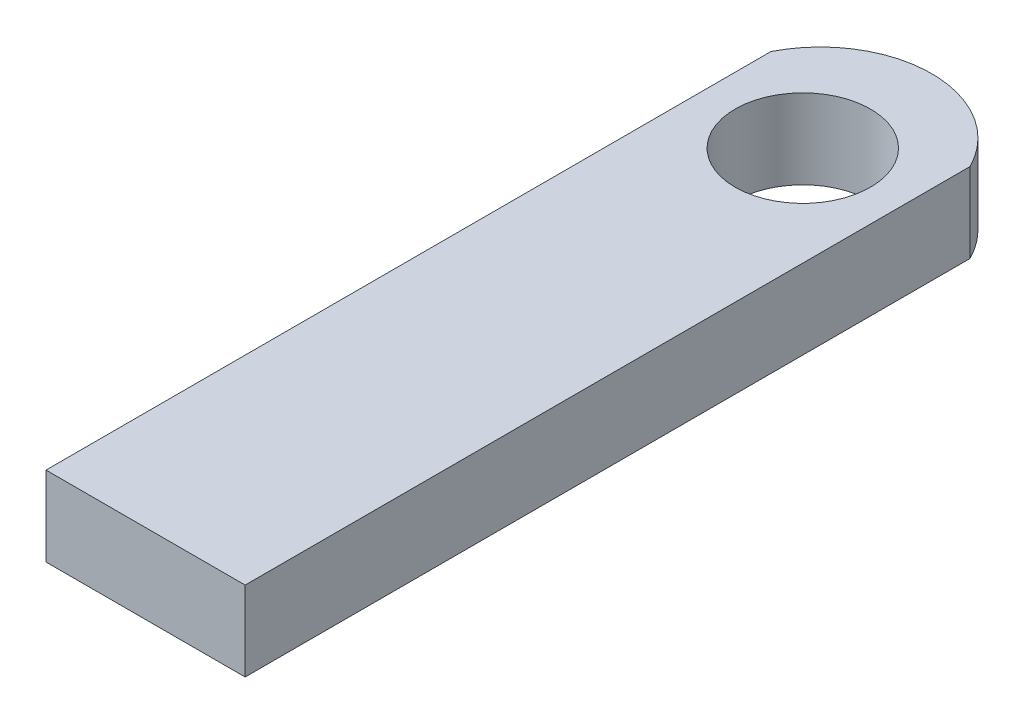
ISO-10303-21;
HEADER;
FILE_DESCRIPTION(('STEP AP214'),'2;1');
FILE_NAME('part.step','',(''),(''),'','','');
FILE_SCHEMA(('AUTOMOTIVE_DESIGN { 1 0 10303 214 1 1 1 1 }'));
ENDSEC;
DATA;
#1=APPLICATION_CONTEXT('core data for automotive mechanical design processes');
#2=APPLICATION_PROTOCOL_DEFINITION('international standard','automotive_design',2000,#1);
#3=PRODUCT_CONTEXT('',#1,'mechanical');
#4=PRODUCT('Part','Part','',(#3));
#5=PRODUCT_RELATED_PRODUCT_CATEGORY('part','',(#4));
#6=PRODUCT_DEFINITION_FORMATION('','',#4);
#7=PRODUCT_DEFINITION_CONTEXT('part definition',#1,'design');
#8=PRODUCT_DEFINITION('design','',#6,#7);
#9=PRODUCT_DEFINITION_SHAPE('','',#8);
#10=(LENGTH_UNIT() NAMED_UNIT(*) SI_UNIT(.MILLI.,.METRE.));
#11=(NAMED_UNIT(*) PLANE_ANGLE_UNIT() SI_UNIT($,.RADIAN.));
#12=(NAMED_UNIT(*) SI_UNIT($,.STERADIAN.) SOLID_ANGLE_UNIT());
#13=UNCERTAINTY_MEASURE_WITH_UNIT(LENGTH_MEASURE(1.E-05),#10,'distance_accuracy_value','');
#14=(GEOMETRIC_REPRESENTATION_CONTEXT(3) GLOBAL_UNCERTAINTY_ASSIGNED_CONTEXT((#13)) GLOBAL_UNIT_ASSIGNED_CONTEXT((#10,
#11,#12)) REPRESENTATION_CONTEXT('',''));
#15=CARTESIAN_POINT('',(0.,0.,0.));
#16=DIRECTION('',(0.,0.,1.));
#17=DIRECTION('',(1.,0.,0.));
#18=AXIS2_PLACEMENT_3D('',#15,#16,#17);
#19=CARTESIAN_POINT('',(-2.5,2.,-16.9390479787082));
#20=DIRECTION('',(0.,-1.,0.));
#21=DIRECTION('',(0.,0.,-1.));
#22=AXIS2_PLACEMENT_3D('',#19,#20,#21);
#23=PLANE('',#22);
#24=DIRECTION('',(0.,0.,-1.));
#25=VECTOR('',#24,1.);
#26=CARTESIAN_POINT('',(0.,2.,-18.2));
#27=LINE('',#26,#25);
#28=CARTESIAN_POINT('',(0.,2.,0.));
#29=VERTEX_POINT('',#28);
#30=CARTESIAN_POINT('',(0.,2.,-18.2));
#31=VERTEX_POINT('',#30);
#32=EDGE_CURVE('E87',#29,#31,#27,.T.);
#33=ORIENTED_EDGE('',*,*,#32,.T.);
#34=CARTESIAN_POINT('',(-2.5,2.,-16.9390479787082));
#35=DIRECTION('',(0.,1.,0.));
#36=DIRECTION('',(0.,0.,-1.));
#37=AXIS2_PLACEMENT_3D('',#34,#35,#36);
#38=CIRCLE('',#37,2.8);
#39=CARTESIAN_POINT('',(-5.,2.,-18.2));
#40=VERTEX_POINT('',#39);
#41=EDGE_CURVE('E82',#31,#40,#38,.T.);
#42=ORIENTED_EDGE('',*,*,#41,.T.);
#43=DIRECTION('',(0.,0.,1.));
#44=VECTOR('',#43,1.);
#45=CARTESIAN_POINT('',(-5.,2.,0.));
#46=LINE('',#45,#44);
#47=CARTESIAN_POINT('',(-5.,2.,0.));
#48=VERTEX_POINT('',#47);
#49=EDGE_CURVE('E85',#40,#48,#46,.T.);
#50=ORIENTED_EDGE('',*,*,#49,.T.);
#51=DIRECTION('',(1.,0.,0.));
#52=VECTOR('',#51,1.);
#53=CARTESIAN_POINT('',(0.,2.,0.));
#54=LINE('',#53,#52);
#55=EDGE_CURVE('E52',#48,#29,#54,.T.);
#56=ORIENTED_EDGE('',*,*,#55,.T.);
#57=EDGE_LOOP('',(#33,#42,#50,#56));
#58=FACE_BOUND('',#57,.T.);
#59=CARTESIAN_POINT('',(-2.5,2.,-16.5));
#60=DIRECTION('',(0.,1.,0.));
#61=DIRECTION('',(0.,0.,1.));
#62=AXIS2_PLACEMENT_3D('',#59,#60,#61);
#63=CIRCLE('',#62,1.7);
#64=CARTESIAN_POINT('',(-2.5,2.,-14.8));
#65=VERTEX_POINT('',#64);
#66=EDGE_CURVE('E102',#65,#65,#63,.T.);
#67=ORIENTED_EDGE('',*,*,#66,.F.);
#68=EDGE_LOOP('',(#67));
#69=FACE_BOUND('',#68,.T.);
#70=ADVANCED_FACE('F35',(#58,#69),#23,.F.);
#71=CARTESIAN_POINT('',(-2.5,0.,-16.9390479787082));
#72=DIRECTION('',(0.,-1.,0.));
#73=DIRECTION('',(0.,0.,-1.));
#74=AXIS2_PLACEMENT_3D('',#71,#72,#73);
#75=PLANE('',#74);
#76=DIRECTION('',(0.,0.,-1.));
#77=VECTOR('',#76,1.);
#78=CARTESIAN_POINT('',(0.,0.,-18.2));
#79=LINE('',#78,#77);
#80=CARTESIAN_POINT('',(0.,0.,0.));
#81=VERTEX_POINT('',#80);
#82=CARTESIAN_POINT('',(0.,0.,-18.2));
#83=VERTEX_POINT('',#82);
#84=EDGE_CURVE('E99',#81,#83,#79,.T.);
#85=ORIENTED_EDGE('',*,*,#84,.F.);
#86=DIRECTION('',(1.,0.,0.));
#87=VECTOR('',#86,1.);
#88=CARTESIAN_POINT('',(0.,0.,0.));
#89=LINE('',#88,#87);
#90=CARTESIAN_POINT('',(-5.,0.,0.));
#91=VERTEX_POINT('',#90);
#92=EDGE_CURVE('E75',#91,#81,#89,.T.);
#93=ORIENTED_EDGE('',*,*,#92,.F.);
#94=DIRECTION('',(0.,0.,1.));
#95=VECTOR('',#94,1.);
#96=CARTESIAN_POINT('',(-5.,0.,0.));
#97=LINE('',#96,#95);
#98=CARTESIAN_POINT('',(-5.,0.,-18.2));
#99=VERTEX_POINT('',#98);
#100=EDGE_CURVE('E69',#99,#91,#97,.T.);
#101=ORIENTED_EDGE('',*,*,#100,.F.);
#102=CARTESIAN_POINT('',(-2.5,0.,-16.9390479787082));
#103=DIRECTION('',(0.,1.,0.));
#104=DIRECTION('',(0.,0.,-1.));
#105=AXIS2_PLACEMENT_3D('',#102,#103,#104);
#106=CIRCLE('',#105,2.8);
#107=EDGE_CURVE('E91',#83,#99,#106,.T.);
#108=ORIENTED_EDGE('',*,*,#107,.F.);
#109=EDGE_LOOP('',(#85,#93,#101,#108));
#110=FACE_BOUND('',#109,.T.);
#111=CARTESIAN_POINT('',(-2.5,0.,-16.5));
#112=DIRECTION('',(0.,1.,0.));
#113=DIRECTION('',(0.,0.,1.));
#114=AXIS2_PLACEMENT_3D('',#111,#112,#113);
#115=CIRCLE('',#114,1.7);
#116=CARTESIAN_POINT('',(-2.5,0.,-14.8));
#117=VERTEX_POINT('',#116);
#118=EDGE_CURVE('E114',#117,#117,#115,.T.);
#119=ORIENTED_EDGE('',*,*,#118,.T.);
#120=EDGE_LOOP('',(#119));
#121=FACE_BOUND('',#120,.T.);
#122=ADVANCED_FACE('F110',(#110,#121),#75,.T.);
#123=CARTESIAN_POINT('',(0.,2.,-18.2));
#124=DIRECTION('',(-1.,0.,0.));
#125=DIRECTION('',(0.,0.,1.));
#126=AXIS2_PLACEMENT_3D('',#123,#124,#125);
#127=PLANE('',#126);
#128=ORIENTED_EDGE('',*,*,#84,.T.);
#129=DIRECTION('',(0.,-1.,0.));
#130=VECTOR('',#129,1.);
#131=CARTESIAN_POINT('',(0.,2.,-18.2));
#132=LINE('',#131,#130);
#133=EDGE_CURVE('E11',#31,#83,#132,.T.);
#134=ORIENTED_EDGE('',*,*,#133,.F.);
#135=ORIENTED_EDGE('',*,*,#32,.F.);
#136=DIRECTION('',(0.,-1.,0.));
#137=VECTOR('',#136,1.);
#138=CARTESIAN_POINT('',(0.,2.,0.));
#139=LINE('',#138,#137);
#140=EDGE_CURVE('E95',#29,#81,#139,.T.);
#141=ORIENTED_EDGE('',*,*,#140,.T.);
#142=EDGE_LOOP('',(#128,#134,#135,#141));
#143=FACE_BOUND('',#142,.T.);
#144=ADVANCED_FACE('F37',(#143),#127,.F.);
#145=CARTESIAN_POINT('',(-2.5,2.,-16.9390479787082));
#146=DIRECTION('',(0.,-1.,0.));
#147=DIRECTION('',(0.,0.,-1.));
#148=AXIS2_PLACEMENT_3D('',#145,#146,#147);
#149=CYLINDRICAL_SURFACE('',#148,2.8);
#150=ORIENTED_EDGE('',*,*,#107,.T.);
#151=DIRECTION('',(0.,-1.,0.));
#152=VECTOR('',#151,1.);
#153=CARTESIAN_POINT('',(-5.,2.,-18.2));
#154=LINE('',#153,#152);
#155=EDGE_CURVE('E44',#40,#99,#154,.T.);
#156=ORIENTED_EDGE('',*,*,#155,.F.);
#157=ORIENTED_EDGE('',*,*,#41,.F.);
#158=ORIENTED_EDGE('',*,*,#133,.T.);
#159=EDGE_LOOP('',(#150,#156,#157,#158));
#160=FACE_BOUND('',#159,.T.);
#161=ADVANCED_FACE('F90',(#160),#149,.T.);
#162=CARTESIAN_POINT('',(-5.,2.,0.));
#163=DIRECTION('',(1.,0.,0.));
#164=DIRECTION('',(0.,0.,-1.));
#165=AXIS2_PLACEMENT_3D('',#162,#163,#164);
#166=PLANE('',#165);
#167=ORIENTED_EDGE('',*,*,#100,.T.);
#168=DIRECTION('',(0.,-1.,0.));
#169=VECTOR('',#168,1.);
#170=CARTESIAN_POINT('',(-5.,2.,0.));
#171=LINE('',#170,#169);
#172=EDGE_CURVE('E92',#48,#91,#171,.T.);
#173=ORIENTED_EDGE('',*,*,#172,.F.);
#174=ORIENTED_EDGE('',*,*,#49,.F.);
#175=ORIENTED_EDGE('',*,*,#155,.T.);
#176=EDGE_LOOP('',(#167,#173,#174,#175));
#177=FACE_BOUND('',#176,.T.);
#178=ADVANCED_FACE('F93',(#177),#166,.F.);
#179=CARTESIAN_POINT('',(0.,2.,0.));
#180=DIRECTION('',(0.,0.,-1.));
#181=DIRECTION('',(-1.,0.,0.));
#182=AXIS2_PLACEMENT_3D('',#179,#180,#181);
#183=PLANE('',#182);
#184=ORIENTED_EDGE('',*,*,#92,.T.);
#185=ORIENTED_EDGE('',*,*,#140,.F.);
#186=ORIENTED_EDGE('',*,*,#55,.F.);
#187=ORIENTED_EDGE('',*,*,#172,.T.);
#188=EDGE_LOOP('',(#184,#185,#186,#187));
#189=FACE_BOUND('',#188,.T.);
#190=ADVANCED_FACE('F107',(#189),#183,.F.);
#191=CARTESIAN_POINT('',(-2.5,2.,-16.5));
#192=DIRECTION('',(0.,-1.,0.));
#193=DIRECTION('',(0.,0.,-1.));
#194=AXIS2_PLACEMENT_3D('',#191,#192,#193);
#195=CYLINDRICAL_SURFACE('',#194,1.7);
#196=ORIENTED_EDGE('',*,*,#66,.T.);
#197=EDGE_LOOP('',(#196));
#198=FACE_BOUND('',#197,.T.);
#199=ORIENTED_EDGE('',*,*,#118,.F.);
#200=EDGE_LOOP('',(#199));
#201=FACE_BOUND('',#200,.T.);
#202=ADVANCED_FACE('F120',(#198,#201),#195,.F.);
#203=CLOSED_SHELL('',(#70,#122,#144,#161,#178,#190,#202));
#204=MANIFOLD_SOLID_BREP('B2',#203);
#205=ADVANCED_BREP_SHAPE_REPRESENTATION('',(#18,#204),#14);
#206=SHAPE_DEFINITION_REPRESENTATION(#9,#205);
ENDSEC;
END-ISO-10303-21;
